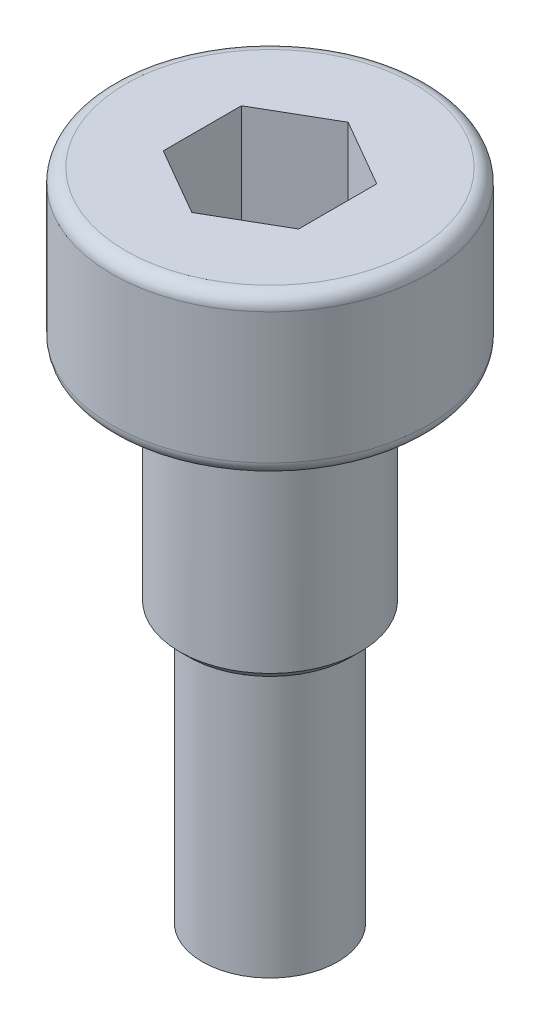
ISO-10303-21;
HEADER;
FILE_DESCRIPTION(('STEP AP214'),'2;1');
FILE_NAME('part.step','',(''),(''),'','','');
FILE_SCHEMA(('AUTOMOTIVE_DESIGN { 1 0 10303 214 1 1 1 1 }'));
ENDSEC;
DATA;
#1=APPLICATION_CONTEXT('core data for automotive mechanical design processes');
#2=APPLICATION_PROTOCOL_DEFINITION('international standard','automotive_design',2000,#1);
#3=PRODUCT_CONTEXT('',#1,'mechanical');
#4=PRODUCT('Part','Part','',(#3));
#5=PRODUCT_RELATED_PRODUCT_CATEGORY('part','',(#4));
#6=PRODUCT_DEFINITION_FORMATION('','',#4);
#7=PRODUCT_DEFINITION_CONTEXT('part definition',#1,'design');
#8=PRODUCT_DEFINITION('design','',#6,#7);
#9=PRODUCT_DEFINITION_SHAPE('','',#8);
#10=(LENGTH_UNIT() NAMED_UNIT(*) SI_UNIT(.MILLI.,.METRE.));
#11=(NAMED_UNIT(*) PLANE_ANGLE_UNIT() SI_UNIT($,.RADIAN.));
#12=(NAMED_UNIT(*) SI_UNIT($,.STERADIAN.) SOLID_ANGLE_UNIT());
#13=UNCERTAINTY_MEASURE_WITH_UNIT(LENGTH_MEASURE(1.E-05),#10,'distance_accuracy_value','');
#14=(GEOMETRIC_REPRESENTATION_CONTEXT(3) GLOBAL_UNCERTAINTY_ASSIGNED_CONTEXT((#13)) GLOBAL_UNIT_ASSIGNED_CONTEXT((#10,
#11,#12)) REPRESENTATION_CONTEXT('',''));
#15=CARTESIAN_POINT('',(0.,0.,0.));
#16=DIRECTION('',(0.,0.,1.));
#17=DIRECTION('',(1.,0.,0.));
#18=AXIS2_PLACEMENT_3D('',#15,#16,#17);
#19=CARTESIAN_POINT('',(0.,9.61644491026167,0.));
#20=DIRECTION('',(0.,1.,0.));
#21=DIRECTION('',(0.,0.,1.));
#22=AXIS2_PLACEMENT_3D('',#19,#20,#21);
#23=PLANE('',#22);
#24=DIRECTION('',(0.,0.,-1.));
#25=VECTOR('',#24,1.);
#26=CARTESIAN_POINT('',(1.5,9.61644491026167,0.86602540378444));
#27=LINE('',#26,#25);
#28=CARTESIAN_POINT('',(1.5,9.61644491026167,0.86602540378444));
#29=VERTEX_POINT('',#28);
#30=CARTESIAN_POINT('',(1.5,9.61644491026167,-0.866025403784439));
#31=VERTEX_POINT('',#30);
#32=EDGE_CURVE('E57',#29,#31,#27,.T.);
#33=ORIENTED_EDGE('',*,*,#32,.F.);
#34=DIRECTION('',(0.866025403784439,0.,-0.5));
#35=VECTOR('',#34,1.);
#36=CARTESIAN_POINT('',(0.,9.61644491026167,1.73205080756888));
#37=LINE('',#36,#35);
#38=CARTESIAN_POINT('',(0.,9.61644491026167,1.73205080756888));
#39=VERTEX_POINT('',#38);
#40=EDGE_CURVE('E140',#39,#29,#37,.T.);
#41=ORIENTED_EDGE('',*,*,#40,.F.);
#42=DIRECTION('',(0.866025403784438,0.,0.5));
#43=VECTOR('',#42,1.);
#44=CARTESIAN_POINT('',(-1.5,9.61644491026167,0.866025403784438));
#45=LINE('',#44,#43);
#46=CARTESIAN_POINT('',(-1.5,9.61644491026167,0.866025403784438));
#47=VERTEX_POINT('',#46);
#48=EDGE_CURVE('E138',#47,#39,#45,.T.);
#49=ORIENTED_EDGE('',*,*,#48,.F.);
#50=DIRECTION('',(0.,0.,1.));
#51=VECTOR('',#50,1.);
#52=CARTESIAN_POINT('',(-1.5,9.61644491026167,-0.866025403784439));
#53=LINE('',#52,#51);
#54=CARTESIAN_POINT('',(-1.5,9.61644491026167,-0.866025403784439));
#55=VERTEX_POINT('',#54);
#56=EDGE_CURVE('E105',#55,#47,#53,.T.);
#57=ORIENTED_EDGE('',*,*,#56,.F.);
#58=DIRECTION('',(-0.866025403784439,0.,0.5));
#59=VECTOR('',#58,1.);
#60=CARTESIAN_POINT('',(0.,9.61644491026167,-1.73205080756888));
#61=LINE('',#60,#59);
#62=CARTESIAN_POINT('',(0.,9.61644491026167,-1.73205080756888));
#63=VERTEX_POINT('',#62);
#64=EDGE_CURVE('E134',#63,#55,#61,.T.);
#65=ORIENTED_EDGE('',*,*,#64,.F.);
#66=DIRECTION('',(-0.866025403784439,0.,-0.5));
#67=VECTOR('',#66,1.);
#68=CARTESIAN_POINT('',(1.5,9.61644491026167,-0.866025403784438));
#69=LINE('',#68,#67);
#70=EDGE_CURVE('E131',#31,#63,#69,.T.);
#71=ORIENTED_EDGE('',*,*,#70,.F.);
#72=EDGE_LOOP('',(#33,#41,#49,#57,#65,#71));
#73=FACE_BOUND('',#72,.T.);
#74=CARTESIAN_POINT('',(0.,9.61644491026167,0.));
#75=DIRECTION('',(0.,1.,0.));
#76=DIRECTION('',(0.,0.,1.));
#77=AXIS2_PLACEMENT_3D('',#74,#75,#76);
#78=CIRCLE('',#77,3.2);
#79=CARTESIAN_POINT('',(0.,9.61644491026167,3.2));
#80=VERTEX_POINT('',#79);
#81=EDGE_CURVE('E167',#80,#80,#78,.T.);
#82=ORIENTED_EDGE('',*,*,#81,.T.);
#83=EDGE_LOOP('',(#82));
#84=FACE_BOUND('',#83,.T.);
#85=ADVANCED_FACE('F41',(#73,#84),#23,.T.);
#86=CARTESIAN_POINT('',(0.,13.2929154984969,0.));
#87=DIRECTION('',(0.,1.,0.));
#88=DIRECTION('',(0.,0.,1.));
#89=AXIS2_PLACEMENT_3D('',#86,#87,#88);
#90=CYLINDRICAL_SURFACE('',#89,3.5);
#91=CARTESIAN_POINT('',(0.,6.41644491026167,0.));
#92=DIRECTION('',(0.,-1.,0.));
#93=DIRECTION('',(0.,0.,-1.));
#94=AXIS2_PLACEMENT_3D('',#91,#92,#93);
#95=CIRCLE('',#94,3.5);
#96=CARTESIAN_POINT('',(0.,6.41644491026167,-3.5));
#97=VERTEX_POINT('',#96);
#98=EDGE_CURVE('E161',#97,#97,#95,.F.);
#99=ORIENTED_EDGE('',*,*,#98,.T.);
#100=EDGE_LOOP('',(#99));
#101=FACE_BOUND('',#100,.T.);
#102=CARTESIAN_POINT('',(0.,9.31644491026167,0.));
#103=DIRECTION('',(0.,1.,0.));
#104=DIRECTION('',(0.,0.,1.));
#105=AXIS2_PLACEMENT_3D('',#102,#103,#104);
#106=CIRCLE('',#105,3.5);
#107=CARTESIAN_POINT('',(0.,9.31644491026167,3.5));
#108=VERTEX_POINT('',#107);
#109=EDGE_CURVE('E158',#108,#108,#106,.F.);
#110=ORIENTED_EDGE('',*,*,#109,.T.);
#111=EDGE_LOOP('',(#110));
#112=FACE_BOUND('',#111,.T.);
#113=ADVANCED_FACE('F184',(#101,#112),#90,.T.);
#114=CARTESIAN_POINT('',(-3.5,6.11644491026167,0.));
#115=DIRECTION('',(0.,-1.,0.));
#116=DIRECTION('',(0.,0.,-1.));
#117=AXIS2_PLACEMENT_3D('',#114,#115,#116);
#118=PLANE('',#117);
#119=CARTESIAN_POINT('',(0.,6.11644491026167,0.));
#120=DIRECTION('',(0.,-1.,0.));
#121=DIRECTION('',(0.,0.,-1.));
#122=AXIS2_PLACEMENT_3D('',#119,#120,#121);
#123=CIRCLE('',#122,3.2);
#124=CARTESIAN_POINT('',(0.,6.11644491026167,-3.2));
#125=VERTEX_POINT('',#124);
#126=EDGE_CURVE('E164',#125,#125,#123,.T.);
#127=ORIENTED_EDGE('',*,*,#126,.T.);
#128=EDGE_LOOP('',(#127));
#129=FACE_BOUND('',#128,.T.);
#130=CARTESIAN_POINT('',(0.,6.11644491026167,0.));
#131=DIRECTION('',(0.,1.,0.));
#132=DIRECTION('',(0.,0.,1.));
#133=AXIS2_PLACEMENT_3D('',#130,#131,#132);
#134=CIRCLE('',#133,2.);
#135=CARTESIAN_POINT('',(0.,6.11644491026167,2.));
#136=VERTEX_POINT('',#135);
#137=EDGE_CURVE('E155',#136,#136,#134,.T.);
#138=ORIENTED_EDGE('',*,*,#137,.T.);
#139=EDGE_LOOP('',(#138));
#140=FACE_BOUND('',#139,.T.);
#141=ADVANCED_FACE('F190',(#129,#140),#118,.T.);
#142=CARTESIAN_POINT('',(0.,13.2929154984969,0.));
#143=DIRECTION('',(0.,1.,0.));
#144=DIRECTION('',(0.,0.,1.));
#145=AXIS2_PLACEMENT_3D('',#142,#143,#144);
#146=CYLINDRICAL_SURFACE('',#145,2.);
#147=CARTESIAN_POINT('',(0.,1.31644491026168,0.));
#148=DIRECTION('',(0.,-1.,0.));
#149=DIRECTION('',(0.,0.,-1.));
#150=AXIS2_PLACEMENT_3D('',#147,#148,#149);
#151=CIRCLE('',#150,2.);
#152=CARTESIAN_POINT('',(0.,1.31644491026168,-2.));
#153=VERTEX_POINT('',#152);
#154=EDGE_CURVE('E50',#153,#153,#151,.F.);
#155=ORIENTED_EDGE('',*,*,#154,.T.);
#156=EDGE_LOOP('',(#155));
#157=FACE_BOUND('',#156,.T.);
#158=ORIENTED_EDGE('',*,*,#137,.F.);
#159=EDGE_LOOP('',(#158));
#160=FACE_BOUND('',#159,.T.);
#161=ADVANCED_FACE('F172',(#157,#160),#146,.T.);
#162=CARTESIAN_POINT('',(-2.,1.11644491026167,0.));
#163=DIRECTION('',(0.,-1.,0.));
#164=DIRECTION('',(0.,0.,-1.));
#165=AXIS2_PLACEMENT_3D('',#162,#163,#164);
#166=PLANE('',#165);
#167=CARTESIAN_POINT('',(0.,1.11644491026167,0.));
#168=DIRECTION('',(0.,-1.,0.));
#169=DIRECTION('',(0.,0.,-1.));
#170=AXIS2_PLACEMENT_3D('',#167,#168,#169);
#171=CIRCLE('',#170,1.79999999999999);
#172=CARTESIAN_POINT('',(0.,1.11644491026167,-1.79999999999999));
#173=VERTEX_POINT('',#172);
#174=EDGE_CURVE('E11',#173,#173,#171,.T.);
#175=ORIENTED_EDGE('',*,*,#174,.T.);
#176=EDGE_LOOP('',(#175));
#177=FACE_BOUND('',#176,.T.);
#178=CARTESIAN_POINT('',(0.,1.11644491026167,0.));
#179=DIRECTION('',(0.,1.,0.));
#180=DIRECTION('',(0.,0.,1.));
#181=AXIS2_PLACEMENT_3D('',#178,#179,#180);
#182=CIRCLE('',#181,1.5);
#183=CARTESIAN_POINT('',(0.,1.11644491026167,1.5));
#184=VERTEX_POINT('',#183);
#185=EDGE_CURVE('E152',#184,#184,#182,.T.);
#186=ORIENTED_EDGE('',*,*,#185,.T.);
#187=EDGE_LOOP('',(#186));
#188=FACE_BOUND('',#187,.T.);
#189=ADVANCED_FACE('F226',(#177,#188),#166,.T.);
#190=CARTESIAN_POINT('',(0.,13.2929154984969,0.));
#191=DIRECTION('',(0.,1.,0.));
#192=DIRECTION('',(0.,0.,1.));
#193=AXIS2_PLACEMENT_3D('',#190,#191,#192);
#194=CYLINDRICAL_SURFACE('',#193,1.5);
#195=CARTESIAN_POINT('',(0.,-4.88355508973833,0.));
#196=DIRECTION('',(0.,1.,0.));
#197=DIRECTION('',(0.,0.,1.));
#198=AXIS2_PLACEMENT_3D('',#195,#196,#197);
#199=CIRCLE('',#198,1.5);
#200=CARTESIAN_POINT('',(0.,-4.88355508973833,1.5));
#201=VERTEX_POINT('',#200);
#202=EDGE_CURVE('E144',#201,#201,#199,.T.);
#203=ORIENTED_EDGE('',*,*,#202,.T.);
#204=EDGE_LOOP('',(#203));
#205=FACE_BOUND('',#204,.T.);
#206=ORIENTED_EDGE('',*,*,#185,.F.);
#207=EDGE_LOOP('',(#206));
#208=FACE_BOUND('',#207,.T.);
#209=ADVANCED_FACE('F222',(#205,#208),#194,.T.);
#210=CARTESIAN_POINT('',(-1.5,-4.88355508973833,0.));
#211=DIRECTION('',(0.,-1.,0.));
#212=DIRECTION('',(0.,0.,-1.));
#213=AXIS2_PLACEMENT_3D('',#210,#211,#212);
#214=PLANE('',#213);
#215=ORIENTED_EDGE('',*,*,#202,.F.);
#216=EDGE_LOOP('',(#215));
#217=FACE_BOUND('',#216,.T.);
#218=ADVANCED_FACE('F199',(#217),#214,.T.);
#219=CARTESIAN_POINT('',(0.,6.41644491026167,0.));
#220=DIRECTION('',(0.,-1.,0.));
#221=DIRECTION('',(0.,0.,-1.));
#222=AXIS2_PLACEMENT_3D('',#219,#220,#221);
#223=TOROIDAL_SURFACE('',#222,3.2,0.3);
#224=ORIENTED_EDGE('',*,*,#126,.F.);
#225=EDGE_LOOP('',(#224));
#226=FACE_BOUND('',#225,.T.);
#227=ORIENTED_EDGE('',*,*,#98,.F.);
#228=EDGE_LOOP('',(#227));
#229=FACE_BOUND('',#228,.T.);
#230=ADVANCED_FACE('F196',(#226,#229),#223,.T.);
#231=CARTESIAN_POINT('',(0.,9.31644491026167,0.));
#232=DIRECTION('',(0.,1.,0.));
#233=DIRECTION('',(0.,0.,1.));
#234=AXIS2_PLACEMENT_3D('',#231,#232,#233);
#235=TOROIDAL_SURFACE('',#234,3.2,0.3);
#236=ORIENTED_EDGE('',*,*,#109,.F.);
#237=EDGE_LOOP('',(#236));
#238=FACE_BOUND('',#237,.T.);
#239=ORIENTED_EDGE('',*,*,#81,.F.);
#240=EDGE_LOOP('',(#239));
#241=FACE_BOUND('',#240,.T.);
#242=ADVANCED_FACE('F198',(#238,#241),#235,.T.);
#243=CARTESIAN_POINT('',(1.5,7.21644491026167,0.86602540378444));
#244=DIRECTION('',(1.,0.,0.));
#245=DIRECTION('',(0.,0.,-1.));
#246=AXIS2_PLACEMENT_3D('',#243,#244,#245);
#247=PLANE('',#246);
#248=ORIENTED_EDGE('',*,*,#32,.T.);
#249=DIRECTION('',(0.,1.,0.));
#250=VECTOR('',#249,1.);
#251=CARTESIAN_POINT('',(1.5,7.21644491026167,-0.866025403784438));
#252=LINE('',#251,#250);
#253=CARTESIAN_POINT('',(1.5,7.21644491026167,-0.866025403784438));
#254=VERTEX_POINT('',#253);
#255=EDGE_CURVE('E87',#254,#31,#252,.T.);
#256=ORIENTED_EDGE('',*,*,#255,.F.);
#257=DIRECTION('',(0.,0.,-1.));
#258=VECTOR('',#257,1.);
#259=CARTESIAN_POINT('',(1.5,7.21644491026167,0.86602540378444));
#260=LINE('',#259,#258);
#261=CARTESIAN_POINT('',(1.5,7.21644491026167,0.86602540378444));
#262=VERTEX_POINT('',#261);
#263=EDGE_CURVE('E142',#262,#254,#260,.T.);
#264=ORIENTED_EDGE('',*,*,#263,.F.);
#265=DIRECTION('',(0.,1.,0.));
#266=VECTOR('',#265,1.);
#267=CARTESIAN_POINT('',(1.5,7.21644491026167,0.86602540378444));
#268=LINE('',#267,#266);
#269=EDGE_CURVE('E65',#262,#29,#268,.T.);
#270=ORIENTED_EDGE('',*,*,#269,.T.);
#271=EDGE_LOOP('',(#248,#256,#264,#270));
#272=FACE_BOUND('',#271,.T.);
#273=ADVANCED_FACE('F202',(#272),#247,.F.);
#274=CARTESIAN_POINT('',(0.,7.21644491026167,1.73205080756888));
#275=DIRECTION('',(0.5,0.,0.866025403784439));
#276=DIRECTION('',(0.866025403784439,0.,-0.5));
#277=AXIS2_PLACEMENT_3D('',#274,#275,#276);
#278=PLANE('',#277);
#279=ORIENTED_EDGE('',*,*,#40,.T.);
#280=ORIENTED_EDGE('',*,*,#269,.F.);
#281=DIRECTION('',(0.866025403784439,0.,-0.5));
#282=VECTOR('',#281,1.);
#283=CARTESIAN_POINT('',(0.,7.21644491026167,1.73205080756888));
#284=LINE('',#283,#282);
#285=CARTESIAN_POINT('',(0.,7.21644491026167,1.73205080756888));
#286=VERTEX_POINT('',#285);
#287=EDGE_CURVE('E117',#286,#262,#284,.T.);
#288=ORIENTED_EDGE('',*,*,#287,.F.);
#289=DIRECTION('',(0.,1.,0.));
#290=VECTOR('',#289,1.);
#291=CARTESIAN_POINT('',(0.,7.21644491026167,1.73205080756888));
#292=LINE('',#291,#290);
#293=EDGE_CURVE('E109',#286,#39,#292,.T.);
#294=ORIENTED_EDGE('',*,*,#293,.T.);
#295=EDGE_LOOP('',(#279,#280,#288,#294));
#296=FACE_BOUND('',#295,.T.);
#297=ADVANCED_FACE('F207',(#296),#278,.F.);
#298=CARTESIAN_POINT('',(-1.5,7.21644491026167,0.866025403784438));
#299=DIRECTION('',(-0.5,0.,0.866025403784439));
#300=DIRECTION('',(0.866025403784439,0.,0.5));
#301=AXIS2_PLACEMENT_3D('',#298,#299,#300);
#302=PLANE('',#301);
#303=ORIENTED_EDGE('',*,*,#48,.T.);
#304=ORIENTED_EDGE('',*,*,#293,.F.);
#305=DIRECTION('',(0.866025403784438,0.,0.5));
#306=VECTOR('',#305,1.);
#307=CARTESIAN_POINT('',(-1.5,7.21644491026167,0.866025403784438));
#308=LINE('',#307,#306);
#309=CARTESIAN_POINT('',(-1.5,7.21644491026167,0.866025403784438));
#310=VERTEX_POINT('',#309);
#311=EDGE_CURVE('E113',#310,#286,#308,.T.);
#312=ORIENTED_EDGE('',*,*,#311,.F.);
#313=DIRECTION('',(0.,1.,0.));
#314=VECTOR('',#313,1.);
#315=CARTESIAN_POINT('',(-1.5,7.21644491026167,0.866025403784438));
#316=LINE('',#315,#314);
#317=EDGE_CURVE('E98',#310,#47,#316,.T.);
#318=ORIENTED_EDGE('',*,*,#317,.T.);
#319=EDGE_LOOP('',(#303,#304,#312,#318));
#320=FACE_BOUND('',#319,.T.);
#321=ADVANCED_FACE('F114',(#320),#302,.F.);
#322=CARTESIAN_POINT('',(-1.5,7.21644491026167,-0.866025403784439));
#323=DIRECTION('',(-1.,0.,0.));
#324=DIRECTION('',(0.,0.,1.));
#325=AXIS2_PLACEMENT_3D('',#322,#323,#324);
#326=PLANE('',#325);
#327=ORIENTED_EDGE('',*,*,#56,.T.);
#328=ORIENTED_EDGE('',*,*,#317,.F.);
#329=DIRECTION('',(0.,0.,1.));
#330=VECTOR('',#329,1.);
#331=CARTESIAN_POINT('',(-1.5,7.21644491026167,-0.866025403784439));
#332=LINE('',#331,#330);
#333=CARTESIAN_POINT('',(-1.5,7.21644491026167,-0.866025403784439));
#334=VERTEX_POINT('',#333);
#335=EDGE_CURVE('E102',#334,#310,#332,.T.);
#336=ORIENTED_EDGE('',*,*,#335,.F.);
#337=DIRECTION('',(0.,1.,0.));
#338=VECTOR('',#337,1.);
#339=CARTESIAN_POINT('',(-1.5,7.21644491026167,-0.866025403784439));
#340=LINE('',#339,#338);
#341=EDGE_CURVE('E110',#334,#55,#340,.T.);
#342=ORIENTED_EDGE('',*,*,#341,.T.);
#343=EDGE_LOOP('',(#327,#328,#336,#342));
#344=FACE_BOUND('',#343,.T.);
#345=ADVANCED_FACE('F100',(#344),#326,.F.);
#346=CARTESIAN_POINT('',(0.,7.21644491026167,-1.73205080756888));
#347=DIRECTION('',(-0.5,0.,-0.866025403784439));
#348=DIRECTION('',(-0.866025403784439,0.,0.5));
#349=AXIS2_PLACEMENT_3D('',#346,#347,#348);
#350=PLANE('',#349);
#351=ORIENTED_EDGE('',*,*,#64,.T.);
#352=ORIENTED_EDGE('',*,*,#341,.F.);
#353=DIRECTION('',(-0.866025403784439,0.,0.5));
#354=VECTOR('',#353,1.);
#355=CARTESIAN_POINT('',(0.,7.21644491026167,-1.73205080756888));
#356=LINE('',#355,#354);
#357=CARTESIAN_POINT('',(0.,7.21644491026167,-1.73205080756888));
#358=VERTEX_POINT('',#357);
#359=EDGE_CURVE('E123',#358,#334,#356,.T.);
#360=ORIENTED_EDGE('',*,*,#359,.F.);
#361=DIRECTION('',(0.,1.,0.));
#362=VECTOR('',#361,1.);
#363=CARTESIAN_POINT('',(0.,7.21644491026167,-1.73205080756888));
#364=LINE('',#363,#362);
#365=EDGE_CURVE('E147',#358,#63,#364,.T.);
#366=ORIENTED_EDGE('',*,*,#365,.T.);
#367=EDGE_LOOP('',(#351,#352,#360,#366));
#368=FACE_BOUND('',#367,.T.);
#369=ADVANCED_FACE('F302',(#368),#350,.F.);
#370=CARTESIAN_POINT('',(1.5,7.21644491026167,-0.866025403784438));
#371=DIRECTION('',(0.5,0.,-0.866025403784439));
#372=DIRECTION('',(-0.866025403784439,0.,-0.5));
#373=AXIS2_PLACEMENT_3D('',#370,#371,#372);
#374=PLANE('',#373);
#375=ORIENTED_EDGE('',*,*,#70,.T.);
#376=ORIENTED_EDGE('',*,*,#365,.F.);
#377=DIRECTION('',(-0.866025403784439,0.,-0.5));
#378=VECTOR('',#377,1.);
#379=CARTESIAN_POINT('',(1.5,7.21644491026167,-0.866025403784438));
#380=LINE('',#379,#378);
#381=EDGE_CURVE('E125',#254,#358,#380,.T.);
#382=ORIENTED_EDGE('',*,*,#381,.F.);
#383=ORIENTED_EDGE('',*,*,#255,.T.);
#384=EDGE_LOOP('',(#375,#376,#382,#383));
#385=FACE_BOUND('',#384,.T.);
#386=ADVANCED_FACE('F180',(#385),#374,.F.);
#387=CARTESIAN_POINT('',(0.,7.21644491026167,0.));
#388=DIRECTION('',(0.,1.,0.));
#389=DIRECTION('',(0.,0.,1.));
#390=AXIS2_PLACEMENT_3D('',#387,#388,#389);
#391=PLANE('',#390);
#392=ORIENTED_EDGE('',*,*,#263,.T.);
#393=ORIENTED_EDGE('',*,*,#381,.T.);
#394=ORIENTED_EDGE('',*,*,#359,.T.);
#395=ORIENTED_EDGE('',*,*,#335,.T.);
#396=ORIENTED_EDGE('',*,*,#311,.T.);
#397=ORIENTED_EDGE('',*,*,#287,.T.);
#398=EDGE_LOOP('',(#392,#393,#394,#395,#396,#397));
#399=FACE_BOUND('',#398,.T.);
#400=ADVANCED_FACE('F120',(#399),#391,.T.);
#401=CARTESIAN_POINT('',(0.,1.31644491026168,0.));
#402=DIRECTION('',(0.,1.,0.));
#403=DIRECTION('',(0.,0.,1.));
#404=AXIS2_PLACEMENT_3D('',#401,#402,#403);
#405=CONICAL_SURFACE('',#404,2.,0.785398163397455);
#406=ORIENTED_EDGE('',*,*,#174,.F.);
#407=EDGE_LOOP('',(#406));
#408=FACE_BOUND('',#407,.T.);
#409=ORIENTED_EDGE('',*,*,#154,.F.);
#410=EDGE_LOOP('',(#409));
#411=FACE_BOUND('',#410,.T.);
#412=ADVANCED_FACE('F44',(#408,#411),#405,.T.);
#413=CLOSED_SHELL('',(#85,#113,#141,#161,#189,#209,#218,#230,#242,#273,#297,#321,#345,#369,#386,
#400,#412));
#414=MANIFOLD_SOLID_BREP('B2',#413);
#415=ADVANCED_BREP_SHAPE_REPRESENTATION('',(#18,#414),#14);
#416=SHAPE_DEFINITION_REPRESENTATION(#9,#415);
ENDSEC;
END-ISO-10303-21;
